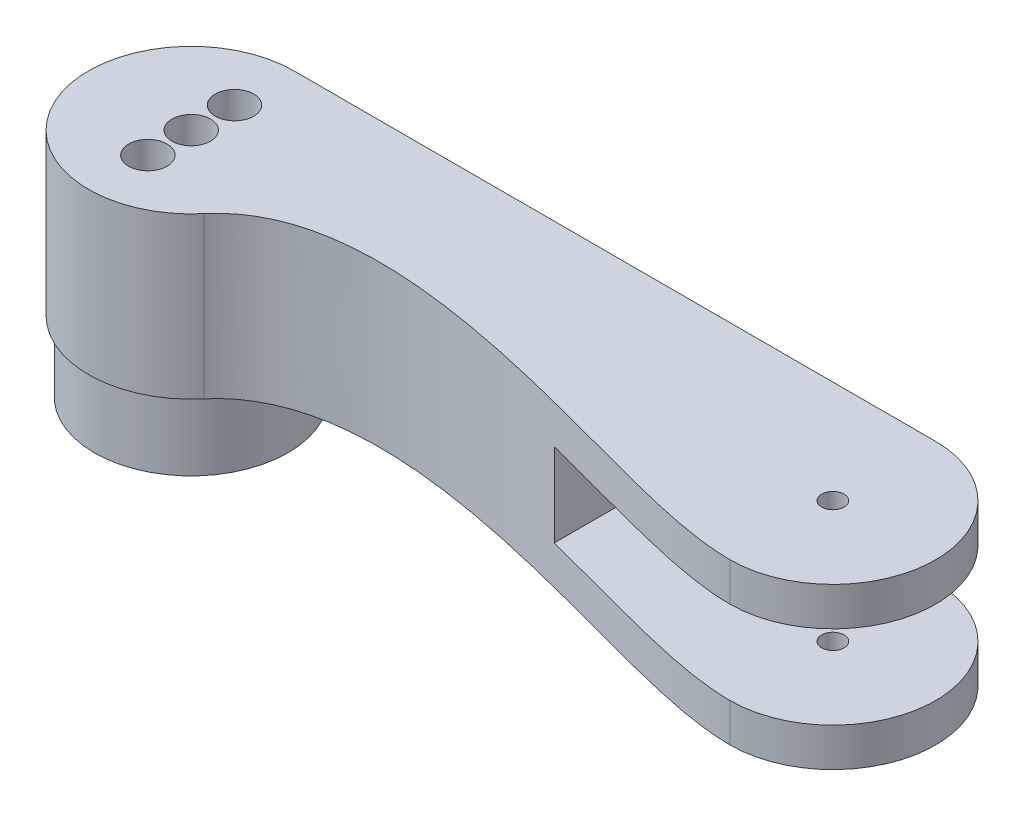
ISO-10303-21;
HEADER;
FILE_DESCRIPTION(('STEP AP214'),'2;1');
FILE_NAME('part.step','',(''),(''),'','','');
FILE_SCHEMA(('AUTOMOTIVE_DESIGN { 1 0 10303 214 1 1 1 1 }'));
ENDSEC;
DATA;
#1=APPLICATION_CONTEXT('core data for automotive mechanical design processes');
#2=APPLICATION_PROTOCOL_DEFINITION('international standard','automotive_design',2000,#1);
#3=PRODUCT_CONTEXT('',#1,'mechanical');
#4=PRODUCT('Part','Part','',(#3));
#5=PRODUCT_RELATED_PRODUCT_CATEGORY('part','',(#4));
#6=PRODUCT_DEFINITION_FORMATION('','',#4);
#7=PRODUCT_DEFINITION_CONTEXT('part definition',#1,'design');
#8=PRODUCT_DEFINITION('design','',#6,#7);
#9=PRODUCT_DEFINITION_SHAPE('','',#8);
#10=(LENGTH_UNIT() NAMED_UNIT(*) SI_UNIT(.MILLI.,.METRE.));
#11=(NAMED_UNIT(*) PLANE_ANGLE_UNIT() SI_UNIT($,.RADIAN.));
#12=(NAMED_UNIT(*) SI_UNIT($,.STERADIAN.) SOLID_ANGLE_UNIT());
#13=UNCERTAINTY_MEASURE_WITH_UNIT(LENGTH_MEASURE(1.E-05),#10,'distance_accuracy_value','');
#14=(GEOMETRIC_REPRESENTATION_CONTEXT(3) GLOBAL_UNCERTAINTY_ASSIGNED_CONTEXT((#13)) GLOBAL_UNIT_ASSIGNED_CONTEXT((#10,
#11,#12)) REPRESENTATION_CONTEXT('',''));
#15=CARTESIAN_POINT('',(0.,0.,0.));
#16=DIRECTION('',(0.,0.,1.));
#17=DIRECTION('',(1.,0.,0.));
#18=AXIS2_PLACEMENT_3D('',#15,#16,#17);
#19=CARTESIAN_POINT('',(-50.,6.,0.));
#20=DIRECTION('',(0.,1.,0.));
#21=DIRECTION('',(0.,0.,1.));
#22=AXIS2_PLACEMENT_3D('',#19,#20,#21);
#23=PLANE('',#22);
#24=CARTESIAN_POINT('',(50.,6.,0.));
#25=DIRECTION('',(0.,-1.,0.));
#26=DIRECTION('',(0.,0.,-1.));
#27=AXIS2_PLACEMENT_3D('',#24,#25,#26);
#28=CIRCLE('',#27,1.75);
#29=CARTESIAN_POINT('',(50.,6.,-1.75000000000002));
#30=VERTEX_POINT('',#29);
#31=EDGE_CURVE('E156',#30,#30,#28,.T.);
#32=ORIENTED_EDGE('',*,*,#31,.T.);
#33=EDGE_LOOP('',(#32));
#34=FACE_BOUND('',#33,.T.);
#35=DIRECTION('',(0.,0.,-1.));
#36=VECTOR('',#35,1.);
#37=CARTESIAN_POINT('',(15.,6.,-16.));
#38=LINE('',#37,#36);
#39=CARTESIAN_POINT('',(15.,6.,8.41957763175547));
#40=VERTEX_POINT('',#39);
#41=CARTESIAN_POINT('',(15.,6.,-16.));
#42=VERTEX_POINT('',#41);
#43=EDGE_CURVE('E93',#40,#42,#38,.T.);
#44=ORIENTED_EDGE('',*,*,#43,.F.);
#45=CARTESIAN_POINT('',(-37.7312638091283,6.,10.2702537592211));
#46=CARTESIAN_POINT('',(-30.3325567034885,6.,1.43183673850023));
#47=CARTESIAN_POINT('',(6.05040288848305,6.,3.3645879726743));
#48=CARTESIAN_POINT('',(38.5122315829498,6.,16.));
#49=CARTESIAN_POINT('',(50.,6.,16.));
#50=B_SPLINE_CURVE_WITH_KNOTS('',3,(#45,#46,#47,#48,#49),.UNSPECIFIED.,.F.,.F.,(4,1,4),(0.,
0.426660682996785,1.),.UNSPECIFIED.);
#51=CARTESIAN_POINT('',(50.,6.,16.));
#52=VERTEX_POINT('',#51);
#53=EDGE_CURVE('E231',#52,#40,#50,.F.);
#54=ORIENTED_EDGE('',*,*,#53,.F.);
#55=CARTESIAN_POINT('',(50.,6.,0.));
#56=DIRECTION('',(0.,1.,0.));
#57=DIRECTION('',(0.,0.,1.));
#58=AXIS2_PLACEMENT_3D('',#55,#56,#57);
#59=CIRCLE('',#58,16.);
#60=CARTESIAN_POINT('',(50.,6.,-16.));
#61=VERTEX_POINT('',#60);
#62=EDGE_CURVE('E73',#52,#61,#59,.T.);
#63=ORIENTED_EDGE('',*,*,#62,.T.);
#64=DIRECTION('',(-1.,0.,0.));
#65=VECTOR('',#64,1.);
#66=CARTESIAN_POINT('',(-50.,6.,-16.));
#67=LINE('',#66,#65);
#68=EDGE_CURVE('E164',#61,#42,#67,.T.);
#69=ORIENTED_EDGE('',*,*,#68,.T.);
#70=EDGE_LOOP('',(#44,#54,#63,#69));
#71=FACE_BOUND('',#70,.T.);
#72=ADVANCED_FACE('F47',(#34,#71),#23,.T.);
#73=CARTESIAN_POINT('',(-50.,0.,0.));
#74=DIRECTION('',(0.,1.,0.));
#75=DIRECTION('',(0.,0.,1.));
#76=AXIS2_PLACEMENT_3D('',#73,#74,#75);
#77=PLANE('',#76);
#78=CARTESIAN_POINT('',(-50.,0.,0.));
#79=DIRECTION('',(0.,1.,0.));
#80=DIRECTION('',(0.,0.,1.));
#81=AXIS2_PLACEMENT_3D('',#78,#79,#80);
#82=CIRCLE('',#81,15.1);
#83=CARTESIAN_POINT('',(-50.,0.,15.1));
#84=VERTEX_POINT('',#83);
#85=EDGE_CURVE('E11',#84,#84,#82,.F.);
#86=ORIENTED_EDGE('',*,*,#85,.F.);
#87=EDGE_LOOP('',(#86));
#88=FACE_BOUND('',#87,.T.);
#89=CARTESIAN_POINT('',(50.,0.,0.));
#90=DIRECTION('',(0.,-1.,0.));
#91=DIRECTION('',(0.,0.,-1.));
#92=AXIS2_PLACEMENT_3D('',#89,#90,#91);
#93=CIRCLE('',#92,1.75);
#94=CARTESIAN_POINT('',(50.,0.,-1.75000000000002));
#95=VERTEX_POINT('',#94);
#96=EDGE_CURVE('E216',#95,#95,#93,.T.);
#97=ORIENTED_EDGE('',*,*,#96,.F.);
#98=EDGE_LOOP('',(#97));
#99=FACE_BOUND('',#98,.T.);
#100=CARTESIAN_POINT('',(-37.7312638091283,0.,10.2702537592211));
#101=CARTESIAN_POINT('',(-30.3325567034885,0.,1.43183673850023));
#102=CARTESIAN_POINT('',(6.05040288848305,0.,3.3645879726743));
#103=CARTESIAN_POINT('',(38.5122315829498,0.,16.));
#104=CARTESIAN_POINT('',(50.,0.,16.));
#105=B_SPLINE_CURVE_WITH_KNOTS('',3,(#100,#101,#102,#103,#104),.UNSPECIFIED.,.F.,.F.,(4,1,4),
(0.,0.426660682996785,1.),.UNSPECIFIED.);
#106=CARTESIAN_POINT('',(50.,0.,16.));
#107=VERTEX_POINT('',#106);
#108=CARTESIAN_POINT('',(-37.7312638091283,0.,10.2702537592211));
#109=VERTEX_POINT('',#108);
#110=EDGE_CURVE('E133',#107,#109,#105,.F.);
#111=ORIENTED_EDGE('',*,*,#110,.T.);
#112=CARTESIAN_POINT('',(-50.,0.,0.));
#113=DIRECTION('',(0.,1.,0.));
#114=DIRECTION('',(0.,0.,1.));
#115=AXIS2_PLACEMENT_3D('',#112,#113,#114);
#116=CIRCLE('',#115,16.);
#117=CARTESIAN_POINT('',(-50.,0.,-16.));
#118=VERTEX_POINT('',#117);
#119=EDGE_CURVE('E151',#118,#109,#116,.T.);
#120=ORIENTED_EDGE('',*,*,#119,.F.);
#121=DIRECTION('',(-1.,0.,0.));
#122=VECTOR('',#121,1.);
#123=CARTESIAN_POINT('',(-50.,0.,-16.));
#124=LINE('',#123,#122);
#125=CARTESIAN_POINT('',(50.,0.,-16.));
#126=VERTEX_POINT('',#125);
#127=EDGE_CURVE('E149',#126,#118,#124,.T.);
#128=ORIENTED_EDGE('',*,*,#127,.F.);
#129=CARTESIAN_POINT('',(50.,0.,0.));
#130=DIRECTION('',(0.,1.,0.));
#131=DIRECTION('',(0.,0.,1.));
#132=AXIS2_PLACEMENT_3D('',#129,#130,#131);
#133=CIRCLE('',#132,16.);
#134=EDGE_CURVE('E85',#107,#126,#133,.T.);
#135=ORIENTED_EDGE('',*,*,#134,.F.);
#136=EDGE_LOOP('',(#111,#120,#128,#135));
#137=FACE_BOUND('',#136,.T.);
#138=ADVANCED_FACE('F148',(#88,#99,#137),#77,.F.);
#139=CARTESIAN_POINT('',(15.,19.,-16.));
#140=DIRECTION('',(-1.,0.,0.));
#141=DIRECTION('',(0.,0.,1.));
#142=AXIS2_PLACEMENT_3D('',#139,#140,#141);
#143=PLANE('',#142);
#144=DIRECTION('',(0.,1.,0.));
#145=VECTOR('',#144,1.);
#146=CARTESIAN_POINT('',(15.,-0.000999999999997531,8.41957763175547));
#147=LINE('',#146,#145);
#148=CARTESIAN_POINT('',(15.0000000031056,19.,8.41957763255016));
#149=VERTEX_POINT('',#148);
#150=EDGE_CURVE('E229',#149,#40,#147,.F.);
#151=ORIENTED_EDGE('',*,*,#150,.T.);
#152=ORIENTED_EDGE('',*,*,#43,.T.);
#153=DIRECTION('',(0.,-1.,0.));
#154=VECTOR('',#153,1.);
#155=CARTESIAN_POINT('',(15.,19.,-16.));
#156=LINE('',#155,#154);
#157=CARTESIAN_POINT('',(15.,19.,-16.));
#158=VERTEX_POINT('',#157);
#159=EDGE_CURVE('E210',#158,#42,#156,.T.);
#160=ORIENTED_EDGE('',*,*,#159,.F.);
#161=DIRECTION('',(0.,0.,-1.));
#162=VECTOR('',#161,1.);
#163=CARTESIAN_POINT('',(15.,19.,-16.));
#164=LINE('',#163,#162);
#165=EDGE_CURVE('E100',#149,#158,#164,.T.);
#166=ORIENTED_EDGE('',*,*,#165,.F.);
#167=EDGE_LOOP('',(#151,#152,#160,#166));
#168=FACE_BOUND('',#167,.T.);
#169=ADVANCED_FACE('F228',(#168),#143,.F.);
#170=CARTESIAN_POINT('',(-50.,19.,0.));
#171=DIRECTION('',(0.,1.,0.));
#172=DIRECTION('',(0.,0.,1.));
#173=AXIS2_PLACEMENT_3D('',#170,#171,#172);
#174=PLANE('',#173);
#175=CARTESIAN_POINT('',(50.,19.,0.));
#176=DIRECTION('',(0.,1.,0.));
#177=DIRECTION('',(0.,0.,1.));
#178=AXIS2_PLACEMENT_3D('',#175,#176,#177);
#179=CIRCLE('',#178,1.75);
#180=CARTESIAN_POINT('',(50.,19.,1.74999999999999));
#181=VERTEX_POINT('',#180);
#182=EDGE_CURVE('E178',#181,#181,#179,.F.);
#183=ORIENTED_EDGE('',*,*,#182,.F.);
#184=EDGE_LOOP('',(#183));
#185=FACE_BOUND('',#184,.T.);
#186=CARTESIAN_POINT('',(-37.7312638091283,19.,10.2702537592211));
#187=CARTESIAN_POINT('',(-30.3325567034885,19.,1.43183673850023));
#188=CARTESIAN_POINT('',(6.05040288848305,19.,3.3645879726743));
#189=CARTESIAN_POINT('',(38.5122315829498,19.,16.));
#190=CARTESIAN_POINT('',(50.,19.,16.));
#191=B_SPLINE_CURVE_WITH_KNOTS('',3,(#186,#187,#188,#189,#190),.UNSPECIFIED.,.F.,.F.,(4,1,4),
(0.,0.426660682996785,1.),.UNSPECIFIED.);
#192=CARTESIAN_POINT('',(50.,19.,16.));
#193=VERTEX_POINT('',#192);
#194=EDGE_CURVE('E140',#193,#149,#191,.F.);
#195=ORIENTED_EDGE('',*,*,#194,.T.);
#196=ORIENTED_EDGE('',*,*,#165,.T.);
#197=DIRECTION('',(-1.,0.,0.));
#198=VECTOR('',#197,1.);
#199=CARTESIAN_POINT('',(-50.,19.,-16.));
#200=LINE('',#199,#198);
#201=CARTESIAN_POINT('',(50.,19.,-16.));
#202=VERTEX_POINT('',#201);
#203=EDGE_CURVE('E177',#202,#158,#200,.T.);
#204=ORIENTED_EDGE('',*,*,#203,.F.);
#205=CARTESIAN_POINT('',(50.,19.,0.));
#206=DIRECTION('',(0.,1.,0.));
#207=DIRECTION('',(0.,0.,1.));
#208=AXIS2_PLACEMENT_3D('',#205,#206,#207);
#209=CIRCLE('',#208,16.);
#210=EDGE_CURVE('E174',#193,#202,#209,.T.);
#211=ORIENTED_EDGE('',*,*,#210,.F.);
#212=EDGE_LOOP('',(#195,#196,#204,#211));
#213=FACE_BOUND('',#212,.T.);
#214=ADVANCED_FACE('F271',(#185,#213),#174,.F.);
#215=CARTESIAN_POINT('',(-50.,25.,0.));
#216=DIRECTION('',(0.,1.,0.));
#217=DIRECTION('',(0.,0.,1.));
#218=AXIS2_PLACEMENT_3D('',#215,#216,#217);
#219=PLANE('',#218);
#220=CARTESIAN_POINT('',(-50.,25.,6.75));
#221=DIRECTION('',(0.,1.,0.));
#222=DIRECTION('',(0.,0.,1.));
#223=AXIS2_PLACEMENT_3D('',#220,#221,#222);
#224=CIRCLE('',#223,3.);
#225=CARTESIAN_POINT('',(-50.,25.,9.75));
#226=VERTEX_POINT('',#225);
#227=EDGE_CURVE('E517',#226,#226,#224,.F.);
#228=ORIENTED_EDGE('',*,*,#227,.T.);
#229=EDGE_LOOP('',(#228));
#230=FACE_BOUND('',#229,.T.);
#231=CARTESIAN_POINT('',(-49.9999999999995,25.,-6.75));
#232=DIRECTION('',(0.,1.,0.));
#233=DIRECTION('',(0.,0.,1.));
#234=AXIS2_PLACEMENT_3D('',#231,#232,#233);
#235=CIRCLE('',#234,3.);
#236=CARTESIAN_POINT('',(-49.9999999999995,25.,-3.75));
#237=VERTEX_POINT('',#236);
#238=EDGE_CURVE('E513',#237,#237,#235,.F.);
#239=ORIENTED_EDGE('',*,*,#238,.T.);
#240=EDGE_LOOP('',(#239));
#241=FACE_BOUND('',#240,.T.);
#242=CARTESIAN_POINT('',(-50.,25.,0.));
#243=DIRECTION('',(0.,1.,0.));
#244=DIRECTION('',(0.,0.,1.));
#245=AXIS2_PLACEMENT_3D('',#242,#243,#244);
#246=CIRCLE('',#245,3.);
#247=CARTESIAN_POINT('',(-50.,25.,3.));
#248=VERTEX_POINT('',#247);
#249=EDGE_CURVE('E497',#248,#248,#246,.F.);
#250=ORIENTED_EDGE('',*,*,#249,.T.);
#251=EDGE_LOOP('',(#250));
#252=FACE_BOUND('',#251,.T.);
#253=CARTESIAN_POINT('',(50.,25.,0.));
#254=DIRECTION('',(0.,1.,0.));
#255=DIRECTION('',(0.,0.,1.));
#256=AXIS2_PLACEMENT_3D('',#253,#254,#255);
#257=CIRCLE('',#256,1.75);
#258=CARTESIAN_POINT('',(50.,25.,1.74999999999999));
#259=VERTEX_POINT('',#258);
#260=EDGE_CURVE('E189',#259,#259,#257,.T.);
#261=ORIENTED_EDGE('',*,*,#260,.F.);
#262=EDGE_LOOP('',(#261));
#263=FACE_BOUND('',#262,.T.);
#264=CARTESIAN_POINT('',(-50.,25.,0.));
#265=DIRECTION('',(0.,1.,0.));
#266=DIRECTION('',(0.,0.,1.));
#267=AXIS2_PLACEMENT_3D('',#264,#265,#266);
#268=CIRCLE('',#267,16.);
#269=CARTESIAN_POINT('',(-50.,25.,-16.));
#270=VERTEX_POINT('',#269);
#271=CARTESIAN_POINT('',(-37.7312638091283,25.,10.2702537592211));
#272=VERTEX_POINT('',#271);
#273=EDGE_CURVE('E64',#270,#272,#268,.T.);
#274=ORIENTED_EDGE('',*,*,#273,.T.);
#275=CARTESIAN_POINT('',(-37.7312638091283,25.,10.2702537592211));
#276=CARTESIAN_POINT('',(-30.3325567034885,25.,1.43183673850023));
#277=CARTESIAN_POINT('',(6.05040288848305,25.,3.3645879726743));
#278=CARTESIAN_POINT('',(38.5122315829498,25.,16.));
#279=CARTESIAN_POINT('',(50.,25.,16.));
#280=B_SPLINE_CURVE_WITH_KNOTS('',3,(#275,#276,#277,#278,#279),.UNSPECIFIED.,.F.,.F.,(4,1,4),
(0.,0.426660682996785,1.),.UNSPECIFIED.);
#281=CARTESIAN_POINT('',(50.,25.,16.));
#282=VERTEX_POINT('',#281);
#283=EDGE_CURVE('E235',#272,#282,#280,.T.);
#284=ORIENTED_EDGE('',*,*,#283,.T.);
#285=CARTESIAN_POINT('',(50.,25.,0.));
#286=DIRECTION('',(0.,1.,0.));
#287=DIRECTION('',(0.,0.,1.));
#288=AXIS2_PLACEMENT_3D('',#285,#286,#287);
#289=CIRCLE('',#288,16.);
#290=CARTESIAN_POINT('',(50.,25.,-16.));
#291=VERTEX_POINT('',#290);
#292=EDGE_CURVE('E200',#282,#291,#289,.T.);
#293=ORIENTED_EDGE('',*,*,#292,.T.);
#294=DIRECTION('',(-1.,0.,0.));
#295=VECTOR('',#294,1.);
#296=CARTESIAN_POINT('',(-50.,25.,-16.));
#297=LINE('',#296,#295);
#298=EDGE_CURVE('E203',#291,#270,#297,.T.);
#299=ORIENTED_EDGE('',*,*,#298,.T.);
#300=EDGE_LOOP('',(#274,#284,#293,#299));
#301=FACE_BOUND('',#300,.T.);
#302=ADVANCED_FACE('F268',(#230,#241,#252,#263,#301),#219,.T.);
#303=CARTESIAN_POINT('',(-50.,6.,0.));
#304=DIRECTION('',(0.,-1.,0.));
#305=DIRECTION('',(0.,0.,-1.));
#306=AXIS2_PLACEMENT_3D('',#303,#304,#305);
#307=CYLINDRICAL_SURFACE('',#306,16.);
#308=ORIENTED_EDGE('',*,*,#119,.T.);
#309=DIRECTION('',(0.,1.,0.));
#310=VECTOR('',#309,1.);
#311=CARTESIAN_POINT('',(-37.7312638091283,-0.001000000000001,10.2702537592211));
#312=LINE('',#311,#310);
#313=EDGE_CURVE('E136',#109,#272,#312,.T.);
#314=ORIENTED_EDGE('',*,*,#313,.T.);
#315=ORIENTED_EDGE('',*,*,#273,.F.);
#316=DIRECTION('',(0.,-1.,0.));
#317=VECTOR('',#316,1.);
#318=CARTESIAN_POINT('',(-50.,6.,-16.));
#319=LINE('',#318,#317);
#320=EDGE_CURVE('E160',#270,#118,#319,.T.);
#321=ORIENTED_EDGE('',*,*,#320,.T.);
#322=EDGE_LOOP('',(#308,#314,#315,#321));
#323=FACE_BOUND('',#322,.T.);
#324=ADVANCED_FACE('F49',(#323),#307,.T.);
#325=CARTESIAN_POINT('',(50.,6.,0.));
#326=DIRECTION('',(0.,-1.,0.));
#327=DIRECTION('',(0.,0.,-1.));
#328=AXIS2_PLACEMENT_3D('',#325,#326,#327);
#329=CYLINDRICAL_SURFACE('',#328,16.);
#330=ORIENTED_EDGE('',*,*,#134,.T.);
#331=DIRECTION('',(0.,-1.,0.));
#332=VECTOR('',#331,1.);
#333=CARTESIAN_POINT('',(50.,6.,-16.));
#334=LINE('',#333,#332);
#335=EDGE_CURVE('E145',#61,#126,#334,.T.);
#336=ORIENTED_EDGE('',*,*,#335,.F.);
#337=ORIENTED_EDGE('',*,*,#62,.F.);
#338=DIRECTION('',(0.,-1.,0.));
#339=VECTOR('',#338,1.);
#340=CARTESIAN_POINT('',(50.,6.,16.));
#341=LINE('',#340,#339);
#342=EDGE_CURVE('E57',#52,#107,#341,.T.);
#343=ORIENTED_EDGE('',*,*,#342,.T.);
#344=EDGE_LOOP('',(#330,#336,#337,#343));
#345=FACE_BOUND('',#344,.T.);
#346=ADVANCED_FACE('F143',(#345),#329,.T.);
#347=CARTESIAN_POINT('',(-50.,6.,-16.));
#348=DIRECTION('',(0.,0.,1.));
#349=DIRECTION('',(1.,0.,0.));
#350=AXIS2_PLACEMENT_3D('',#347,#348,#349);
#351=PLANE('',#350);
#352=ORIENTED_EDGE('',*,*,#127,.T.);
#353=ORIENTED_EDGE('',*,*,#320,.F.);
#354=ORIENTED_EDGE('',*,*,#298,.F.);
#355=DIRECTION('',(0.,-1.,0.));
#356=VECTOR('',#355,1.);
#357=CARTESIAN_POINT('',(50.,25.,-16.));
#358=LINE('',#357,#356);
#359=EDGE_CURVE('E171',#291,#202,#358,.T.);
#360=ORIENTED_EDGE('',*,*,#359,.T.);
#361=ORIENTED_EDGE('',*,*,#203,.T.);
#362=ORIENTED_EDGE('',*,*,#159,.T.);
#363=ORIENTED_EDGE('',*,*,#68,.F.);
#364=ORIENTED_EDGE('',*,*,#335,.T.);
#365=EDGE_LOOP('',(#352,#353,#354,#360,#361,#362,#363,#364));
#366=FACE_BOUND('',#365,.T.);
#367=ADVANCED_FACE('F227',(#366),#351,.F.);
#368=CARTESIAN_POINT('',(50.,6.,0.));
#369=DIRECTION('',(0.,-1.,0.));
#370=DIRECTION('',(0.,0.,-1.));
#371=AXIS2_PLACEMENT_3D('',#368,#369,#370);
#372=CYLINDRICAL_SURFACE('',#371,1.75);
#373=ORIENTED_EDGE('',*,*,#31,.F.);
#374=EDGE_LOOP('',(#373));
#375=FACE_BOUND('',#374,.T.);
#376=ORIENTED_EDGE('',*,*,#96,.T.);
#377=EDGE_LOOP('',(#376));
#378=FACE_BOUND('',#377,.T.);
#379=ADVANCED_FACE('F278',(#375,#378),#372,.F.);
#380=CARTESIAN_POINT('',(50.,25.,0.));
#381=DIRECTION('',(0.,-1.,0.));
#382=DIRECTION('',(0.,0.,-1.));
#383=AXIS2_PLACEMENT_3D('',#380,#381,#382);
#384=CYLINDRICAL_SURFACE('',#383,16.);
#385=ORIENTED_EDGE('',*,*,#210,.T.);
#386=ORIENTED_EDGE('',*,*,#359,.F.);
#387=ORIENTED_EDGE('',*,*,#292,.F.);
#388=DIRECTION('',(0.,-1.,0.));
#389=VECTOR('',#388,1.);
#390=CARTESIAN_POINT('',(50.,25.,16.));
#391=LINE('',#390,#389);
#392=EDGE_CURVE('E167',#282,#193,#391,.T.);
#393=ORIENTED_EDGE('',*,*,#392,.T.);
#394=EDGE_LOOP('',(#385,#386,#387,#393));
#395=FACE_BOUND('',#394,.T.);
#396=ADVANCED_FACE('F266',(#395),#384,.T.);
#397=CARTESIAN_POINT('',(50.,-0.001000000000001,0.));
#398=DIRECTION('',(0.,1.,0.));
#399=DIRECTION('',(0.,0.,1.));
#400=AXIS2_PLACEMENT_3D('',#397,#398,#399);
#401=CYLINDRICAL_SURFACE('',#400,1.75);
#402=ORIENTED_EDGE('',*,*,#260,.T.);
#403=EDGE_LOOP('',(#402));
#404=FACE_BOUND('',#403,.T.);
#405=ORIENTED_EDGE('',*,*,#182,.T.);
#406=EDGE_LOOP('',(#405));
#407=FACE_BOUND('',#406,.T.);
#408=ADVANCED_FACE('F262',(#404,#407),#401,.F.);
#409=CARTESIAN_POINT('',(-37.7312638091283,-0.000999999999997531,10.2702537592211));
#410=CARTESIAN_POINT('',(-30.3325567034885,-0.000999999999997531,1.43183673850023));
#411=CARTESIAN_POINT('',(6.05040288848305,-0.000999999999997531,3.3645879726743));
#412=CARTESIAN_POINT('',(38.5122315829498,-0.000999999999997531,16.));
#413=CARTESIAN_POINT('',(50.,-0.000999999999997531,16.));
#414=B_SPLINE_CURVE_WITH_KNOTS('',3,(#409,#410,#411,#412,#413),.UNSPECIFIED.,.F.,.F.,(4,1,4),
(0.,0.426660682996785,1.),.UNSPECIFIED.);
#415=DIRECTION('',(0.,1.,0.));
#416=VECTOR('',#415,1.);
#417=SURFACE_OF_LINEAR_EXTRUSION('',#414,#416);
#418=ORIENTED_EDGE('',*,*,#342,.F.);
#419=ORIENTED_EDGE('',*,*,#53,.T.);
#420=ORIENTED_EDGE('',*,*,#150,.F.);
#421=ORIENTED_EDGE('',*,*,#194,.F.);
#422=ORIENTED_EDGE('',*,*,#392,.F.);
#423=ORIENTED_EDGE('',*,*,#283,.F.);
#424=ORIENTED_EDGE('',*,*,#313,.F.);
#425=ORIENTED_EDGE('',*,*,#110,.F.);
#426=EDGE_LOOP('',(#418,#419,#420,#421,#422,#423,#424,#425));
#427=FACE_BOUND('',#426,.T.);
#428=ADVANCED_FACE('F134',(#427),#417,.T.);
#429=CARTESIAN_POINT('',(-50.,-11.,0.));
#430=DIRECTION('',(0.,1.,0.));
#431=DIRECTION('',(0.,0.,1.));
#432=AXIS2_PLACEMENT_3D('',#429,#430,#431);
#433=CYLINDRICAL_SURFACE('',#432,15.1);
#434=CARTESIAN_POINT('',(-50.,-11.,0.));
#435=DIRECTION('',(0.,-1.,0.));
#436=DIRECTION('',(0.,0.,-1.));
#437=AXIS2_PLACEMENT_3D('',#434,#435,#436);
#438=CIRCLE('',#437,15.1);
#439=CARTESIAN_POINT('',(-50.,-11.,-15.1));
#440=VERTEX_POINT('',#439);
#441=EDGE_CURVE('E141',#440,#440,#438,.T.);
#442=ORIENTED_EDGE('',*,*,#441,.F.);
#443=EDGE_LOOP('',(#442));
#444=FACE_BOUND('',#443,.T.);
#445=ORIENTED_EDGE('',*,*,#85,.T.);
#446=EDGE_LOOP('',(#445));
#447=FACE_BOUND('',#446,.T.);
#448=ADVANCED_FACE('F261',(#444,#447),#433,.T.);
#449=CARTESIAN_POINT('',(-50.,-11.,0.));
#450=DIRECTION('',(0.,-1.,0.));
#451=DIRECTION('',(0.,0.,-1.));
#452=AXIS2_PLACEMENT_3D('',#449,#450,#451);
#453=PLANE('',#452);
#454=CARTESIAN_POINT('',(-50.,-11.,0.));
#455=DIRECTION('',(0.,-1.,0.));
#456=DIRECTION('',(0.,0.,-1.));
#457=AXIS2_PLACEMENT_3D('',#454,#455,#456);
#458=CIRCLE('',#457,3.);
#459=CARTESIAN_POINT('',(-50.,-11.,3.));
#460=VERTEX_POINT('',#459);
#461=EDGE_CURVE('E51',#460,#460,#458,.F.);
#462=ORIENTED_EDGE('',*,*,#461,.T.);
#463=EDGE_LOOP('',(#462));
#464=FACE_BOUND('',#463,.T.);
#465=CARTESIAN_POINT('',(-50.,-11.,6.75));
#466=DIRECTION('',(0.,-1.,0.));
#467=DIRECTION('',(0.,0.,-1.));
#468=AXIS2_PLACEMENT_3D('',#465,#466,#467);
#469=CIRCLE('',#468,1.75);
#470=CARTESIAN_POINT('',(-50.,-11.,5.));
#471=VERTEX_POINT('',#470);
#472=EDGE_CURVE('E481',#471,#471,#469,.T.);
#473=ORIENTED_EDGE('',*,*,#472,.F.);
#474=EDGE_LOOP('',(#473));
#475=FACE_BOUND('',#474,.T.);
#476=CARTESIAN_POINT('',(-50.,-11.,-6.75));
#477=DIRECTION('',(0.,-1.,0.));
#478=DIRECTION('',(0.,0.,-1.));
#479=AXIS2_PLACEMENT_3D('',#476,#477,#478);
#480=CIRCLE('',#479,1.75);
#481=CARTESIAN_POINT('',(-50.,-11.,-8.5));
#482=VERTEX_POINT('',#481);
#483=EDGE_CURVE('E485',#482,#482,#480,.T.);
#484=ORIENTED_EDGE('',*,*,#483,.F.);
#485=EDGE_LOOP('',(#484));
#486=FACE_BOUND('',#485,.T.);
#487=ORIENTED_EDGE('',*,*,#441,.T.);
#488=EDGE_LOOP('',(#487));
#489=FACE_BOUND('',#488,.T.);
#490=ADVANCED_FACE('F435',(#464,#475,#486,#489),#453,.T.);
#491=CARTESIAN_POINT('',(-50.,-0.999999999999999,-6.75));
#492=DIRECTION('',(0.,-1.,0.));
#493=DIRECTION('',(0.,0.,-1.));
#494=AXIS2_PLACEMENT_3D('',#491,#492,#493);
#495=CYLINDRICAL_SURFACE('',#494,1.75);
#496=CARTESIAN_POINT('',(-50.,-0.999999999999999,-6.75));
#497=DIRECTION('',(0.,-1.,0.));
#498=DIRECTION('',(0.,0.,-1.));
#499=AXIS2_PLACEMENT_3D('',#496,#497,#498);
#500=CIRCLE('',#499,1.75);
#501=CARTESIAN_POINT('',(-50.,-0.999999999999999,-8.5));
#502=VERTEX_POINT('',#501);
#503=EDGE_CURVE('E488',#502,#502,#500,.T.);
#504=ORIENTED_EDGE('',*,*,#503,.F.);
#505=EDGE_LOOP('',(#504));
#506=FACE_BOUND('',#505,.T.);
#507=ORIENTED_EDGE('',*,*,#483,.T.);
#508=EDGE_LOOP('',(#507));
#509=FACE_BOUND('',#508,.T.);
#510=ADVANCED_FACE('F426',(#506,#509),#495,.F.);
#511=CARTESIAN_POINT('',(-50.,-0.999999999999999,6.75));
#512=DIRECTION('',(0.,-1.,0.));
#513=DIRECTION('',(0.,0.,-1.));
#514=AXIS2_PLACEMENT_3D('',#511,#512,#513);
#515=CYLINDRICAL_SURFACE('',#514,1.75);
#516=CARTESIAN_POINT('',(-50.,-0.999999999999999,6.75));
#517=DIRECTION('',(0.,-1.,0.));
#518=DIRECTION('',(0.,0.,-1.));
#519=AXIS2_PLACEMENT_3D('',#516,#517,#518);
#520=CIRCLE('',#519,1.75);
#521=CARTESIAN_POINT('',(-50.,-0.999999999999999,5.));
#522=VERTEX_POINT('',#521);
#523=EDGE_CURVE('E498',#522,#522,#520,.T.);
#524=ORIENTED_EDGE('',*,*,#523,.F.);
#525=EDGE_LOOP('',(#524));
#526=FACE_BOUND('',#525,.T.);
#527=ORIENTED_EDGE('',*,*,#472,.T.);
#528=EDGE_LOOP('',(#527));
#529=FACE_BOUND('',#528,.T.);
#530=ADVANCED_FACE('F417',(#526,#529),#515,.F.);
#531=CARTESIAN_POINT('',(-50.,-11.000012,0.));
#532=DIRECTION('',(0.,1.,0.));
#533=DIRECTION('',(0.,0.,1.));
#534=AXIS2_PLACEMENT_3D('',#531,#532,#533);
#535=CYLINDRICAL_SURFACE('',#534,3.);
#536=CARTESIAN_POINT('',(-50.,-11.,3.));
#537=CARTESIAN_POINT('',(-50.,-10.625,3.));
#538=CARTESIAN_POINT('',(-50.,-10.25,3.));
#539=CARTESIAN_POINT('',(-50.,-9.5,3.));
#540=CARTESIAN_POINT('',(-50.,-9.125,3.));
#541=CARTESIAN_POINT('',(-50.,-8.375,3.));
#542=CARTESIAN_POINT('',(-50.,-8.,3.));
#543=CARTESIAN_POINT('',(-50.,-7.25,3.));
#544=CARTESIAN_POINT('',(-50.,-6.875,3.));
#545=CARTESIAN_POINT('',(-50.,-6.125,3.));
#546=CARTESIAN_POINT('',(-50.,-5.75,3.));
#547=CARTESIAN_POINT('',(-50.,-5.,3.));
#548=CARTESIAN_POINT('',(-50.,-4.625,3.));
#549=CARTESIAN_POINT('',(-50.,-3.875,3.));
#550=CARTESIAN_POINT('',(-50.,-3.5,3.));
#551=CARTESIAN_POINT('',(-50.,-2.75,3.));
#552=CARTESIAN_POINT('',(-50.,-2.375,3.));
#553=CARTESIAN_POINT('',(-50.,-1.625,3.));
#554=CARTESIAN_POINT('',(-50.,-1.25,3.));
#555=CARTESIAN_POINT('',(-50.,-0.499999999999996,3.));
#556=CARTESIAN_POINT('',(-50.,-0.124999999999996,3.));
#557=CARTESIAN_POINT('',(-50.,0.625000000000004,3.));
#558=CARTESIAN_POINT('',(-50.,1.,3.));
#559=CARTESIAN_POINT('',(-50.,1.75000000000001,3.));
#560=CARTESIAN_POINT('',(-50.,2.12500000000001,3.));
#561=CARTESIAN_POINT('',(-50.,2.87500000000001,3.));
#562=CARTESIAN_POINT('',(-50.,3.25,3.));
#563=CARTESIAN_POINT('',(-50.,4.,3.));
#564=CARTESIAN_POINT('',(-50.,4.375,3.));
#565=CARTESIAN_POINT('',(-50.,5.125,3.));
#566=CARTESIAN_POINT('',(-50.,5.5,3.));
#567=CARTESIAN_POINT('',(-50.,6.25,3.));
#568=CARTESIAN_POINT('',(-50.,6.625,3.));
#569=CARTESIAN_POINT('',(-50.,7.375,3.));
#570=CARTESIAN_POINT('',(-50.,7.75,3.));
#571=CARTESIAN_POINT('',(-50.,8.5,3.));
#572=CARTESIAN_POINT('',(-50.,8.875,3.));
#573=CARTESIAN_POINT('',(-50.,9.625,3.));
#574=CARTESIAN_POINT('',(-50.,10.,3.));
#575=CARTESIAN_POINT('',(-50.,10.75,3.));
#576=CARTESIAN_POINT('',(-50.,11.125,3.));
#577=CARTESIAN_POINT('',(-50.,11.875,3.));
#578=CARTESIAN_POINT('',(-50.,12.25,3.));
#579=CARTESIAN_POINT('',(-50.,13.,3.));
#580=CARTESIAN_POINT('',(-50.,13.375,3.));
#581=CARTESIAN_POINT('',(-50.,14.125,3.));
#582=CARTESIAN_POINT('',(-50.,14.5,3.));
#583=CARTESIAN_POINT('',(-50.,15.25,3.));
#584=CARTESIAN_POINT('',(-50.,15.625,3.));
#585=CARTESIAN_POINT('',(-50.,16.375,3.));
#586=CARTESIAN_POINT('',(-50.,16.75,3.));
#587=CARTESIAN_POINT('',(-50.,17.5,3.));
#588=CARTESIAN_POINT('',(-50.,17.875,3.));
#589=CARTESIAN_POINT('',(-50.,18.625,3.));
#590=CARTESIAN_POINT('',(-50.,19.,3.));
#591=CARTESIAN_POINT('',(-50.,19.75,3.));
#592=CARTESIAN_POINT('',(-50.,20.125,3.));
#593=CARTESIAN_POINT('',(-50.,20.875,3.));
#594=CARTESIAN_POINT('',(-50.,21.25,3.));
#595=CARTESIAN_POINT('',(-50.,22.,3.));
#596=CARTESIAN_POINT('',(-50.,22.375,3.));
#597=CARTESIAN_POINT('',(-50.,23.125,3.));
#598=CARTESIAN_POINT('',(-50.,23.5,3.));
#599=CARTESIAN_POINT('',(-50.,24.25,3.));
#600=CARTESIAN_POINT('',(-50.,24.625,3.));
#601=CARTESIAN_POINT('',(-50.,25.,3.));
#602=B_SPLINE_CURVE_WITH_KNOTS('',3,(#536,#537,#538,#539,#540,#541,#542,#543,#544,#545,#546,
#547,#548,#549,#550,#551,#552,#553,#554,#555,#556,#557,#558,#559,#560,#561,#562,#563,#564,#565,
#566,#567,#568,#569,#570,#571,#572,#573,#574,#575,#576,#577,#578,#579,#580,#581,#582,#583,#584,
#585,#586,#587,#588,#589,#590,#591,#592,#593,#594,#595,#596,#597,#598,#599,#600,#601),
.UNSPECIFIED.,.F.,.F.,(4,2,2,2,2,2,2,2,2,2,2,2,2,2,2,2,2,2,2,2,2,2,2,2,2,2,2,2,2,2,2,2,4),(0.,
1.125,2.25,3.375,4.5,5.625,6.75,7.875,9.,10.125,11.25,12.375,13.5,14.625,15.75,16.875,18.,
19.125,20.25,21.375,22.5,23.625,24.75,25.875,27.,28.125,29.25,30.375,31.5,32.625,33.75,34.875,
36.),.UNSPECIFIED.);
#603=EDGE_CURVE('BSEAM371',#460,#248,#602,.T.);
#604=ORIENTED_EDGE('',*,*,#461,.F.);
#605=ORIENTED_EDGE('',*,*,#249,.F.);
#606=ORIENTED_EDGE('',*,*,#603,.T.);
#607=ORIENTED_EDGE('',*,*,#603,.F.);
#608=EDGE_LOOP('',(#604,#606,#605,#607));
#609=FACE_BOUND('',#608,.T.);
#610=ADVANCED_FACE('F371',(#609),#535,.F.);
#611=CARTESIAN_POINT('',(-49.9999999999995,25.001025,-6.75));
#612=DIRECTION('',(0.,-1.,0.));
#613=DIRECTION('',(0.,0.,-1.));
#614=AXIS2_PLACEMENT_3D('',#611,#612,#613);
#615=CYLINDRICAL_SURFACE('',#614,3.);
#616=ORIENTED_EDGE('',*,*,#238,.F.);
#617=EDGE_LOOP('',(#616));
#618=FACE_BOUND('',#617,.T.);
#619=CARTESIAN_POINT('',(-49.9999999999995,-0.999999999999999,-6.75));
#620=DIRECTION('',(0.,-1.,0.));
#621=DIRECTION('',(0.,0.,-1.));
#622=AXIS2_PLACEMENT_3D('',#619,#620,#621);
#623=CIRCLE('',#622,3.);
#624=CARTESIAN_POINT('',(-49.9999999999995,-0.999999999999999,-9.75));
#625=VERTEX_POINT('',#624);
#626=EDGE_CURVE('E509',#625,#625,#623,.T.);
#627=ORIENTED_EDGE('',*,*,#626,.T.);
#628=EDGE_LOOP('',(#627));
#629=FACE_BOUND('',#628,.T.);
#630=ADVANCED_FACE('F375',(#618,#629),#615,.F.);
#631=CARTESIAN_POINT('',(-49.9999999999995,-0.999999999999999,-6.75));
#632=DIRECTION('',(0.,-1.,0.));
#633=DIRECTION('',(0.,0.,-1.));
#634=AXIS2_PLACEMENT_3D('',#631,#632,#633);
#635=PLANE('',#634);
#636=ORIENTED_EDGE('',*,*,#503,.T.);
#637=EDGE_LOOP('',(#636));
#638=FACE_BOUND('',#637,.T.);
#639=ORIENTED_EDGE('',*,*,#626,.F.);
#640=EDGE_LOOP('',(#639));
#641=FACE_BOUND('',#640,.T.);
#642=ADVANCED_FACE('F379',(#638,#641),#635,.F.);
#643=CARTESIAN_POINT('',(-50.,25.001025,6.75));
#644=DIRECTION('',(0.,-1.,0.));
#645=DIRECTION('',(0.,0.,-1.));
#646=AXIS2_PLACEMENT_3D('',#643,#644,#645);
#647=CYLINDRICAL_SURFACE('',#646,3.);
#648=ORIENTED_EDGE('',*,*,#227,.F.);
#649=EDGE_LOOP('',(#648));
#650=FACE_BOUND('',#649,.T.);
#651=CARTESIAN_POINT('',(-50.,-0.999999999999999,6.75));
#652=DIRECTION('',(0.,-1.,0.));
#653=DIRECTION('',(0.,0.,-1.));
#654=AXIS2_PLACEMENT_3D('',#651,#652,#653);
#655=CIRCLE('',#654,3.);
#656=CARTESIAN_POINT('',(-50.,-0.999999999999999,3.75));
#657=VERTEX_POINT('',#656);
#658=EDGE_CURVE('E505',#657,#657,#655,.T.);
#659=ORIENTED_EDGE('',*,*,#658,.T.);
#660=EDGE_LOOP('',(#659));
#661=FACE_BOUND('',#660,.T.);
#662=ADVANCED_FACE('F388',(#650,#661),#647,.F.);
#663=CARTESIAN_POINT('',(-50.,-0.999999999999999,6.75));
#664=DIRECTION('',(0.,-1.,0.));
#665=DIRECTION('',(0.,0.,-1.));
#666=AXIS2_PLACEMENT_3D('',#663,#664,#665);
#667=PLANE('',#666);
#668=ORIENTED_EDGE('',*,*,#523,.T.);
#669=EDGE_LOOP('',(#668));
#670=FACE_BOUND('',#669,.T.);
#671=ORIENTED_EDGE('',*,*,#658,.F.);
#672=EDGE_LOOP('',(#671));
#673=FACE_BOUND('',#672,.T.);
#674=ADVANCED_FACE('F397',(#670,#673),#667,.F.);
#675=CLOSED_SHELL('',(#72,#138,#169,#214,#302,#324,#346,#367,#379,#396,#408,#428,#448,#490,#510,
#530,#610,#630,#642,#662,#674));
#676=MANIFOLD_SOLID_BREP('B2',#675);
#677=ADVANCED_BREP_SHAPE_REPRESENTATION('',(#18,#676),#14);
#678=SHAPE_DEFINITION_REPRESENTATION(#9,#677);
ENDSEC;
END-ISO-10303-21;
